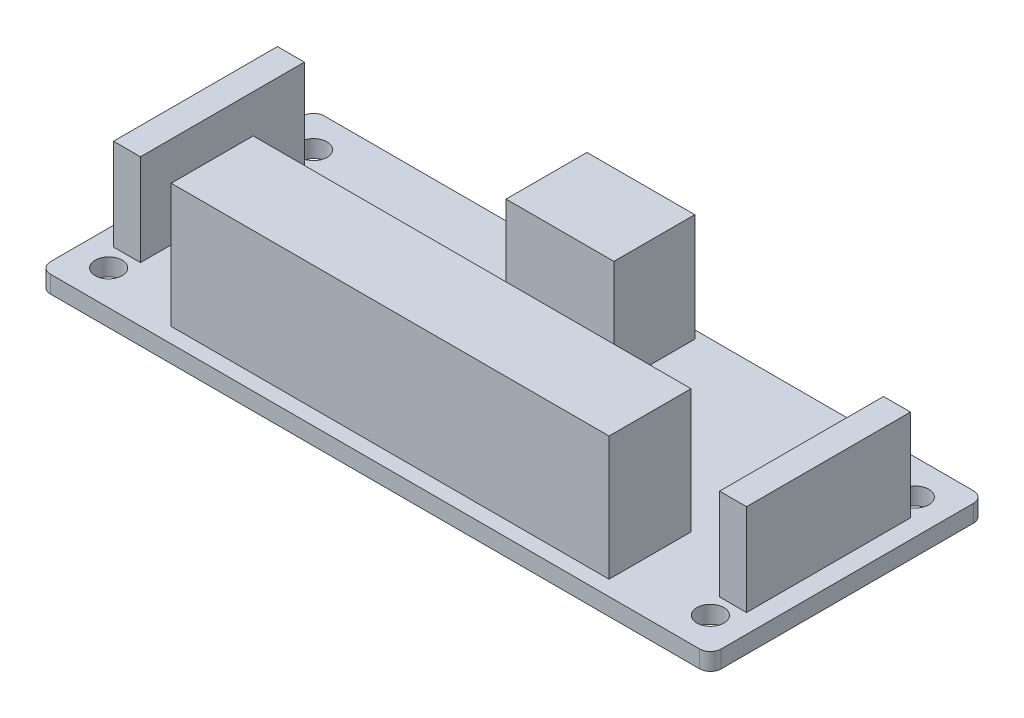
ISO-10303-21;
HEADER;
FILE_DESCRIPTION(('STEP AP214'),'2;1');
FILE_NAME('part.step','',(''),(''),'','','');
FILE_SCHEMA(('AUTOMOTIVE_DESIGN { 1 0 10303 214 1 1 1 1 }'));
ENDSEC;
DATA;
#1=APPLICATION_CONTEXT('core data for automotive mechanical design processes');
#2=APPLICATION_PROTOCOL_DEFINITION('international standard','automotive_design',2000,#1);
#3=PRODUCT_CONTEXT('',#1,'mechanical');
#4=PRODUCT('Part','Part','',(#3));
#5=PRODUCT_RELATED_PRODUCT_CATEGORY('part','',(#4));
#6=PRODUCT_DEFINITION_FORMATION('','',#4);
#7=PRODUCT_DEFINITION_CONTEXT('part definition',#1,'design');
#8=PRODUCT_DEFINITION('design','',#6,#7);
#9=PRODUCT_DEFINITION_SHAPE('','',#8);
#10=(LENGTH_UNIT() NAMED_UNIT(*) SI_UNIT(.MILLI.,.METRE.));
#11=(NAMED_UNIT(*) PLANE_ANGLE_UNIT() SI_UNIT($,.RADIAN.));
#12=(NAMED_UNIT(*) SI_UNIT($,.STERADIAN.) SOLID_ANGLE_UNIT());
#13=UNCERTAINTY_MEASURE_WITH_UNIT(LENGTH_MEASURE(1.E-05),#10,'distance_accuracy_value','');
#14=(GEOMETRIC_REPRESENTATION_CONTEXT(3) GLOBAL_UNCERTAINTY_ASSIGNED_CONTEXT((#13)) GLOBAL_UNIT_ASSIGNED_CONTEXT((#10,
#11,#12)) REPRESENTATION_CONTEXT('',''));
#15=CARTESIAN_POINT('',(0.,0.,0.));
#16=DIRECTION('',(0.,0.,1.));
#17=DIRECTION('',(1.,0.,0.));
#18=AXIS2_PLACEMENT_3D('',#15,#16,#17);
#19=CARTESIAN_POINT('',(-30.1,10.1,-49.7));
#20=DIRECTION('',(0.,-1.,0.));
#21=DIRECTION('',(0.,0.,-1.));
#22=AXIS2_PLACEMENT_3D('',#19,#20,#21);
#23=PLANE('',#22);
#24=DIRECTION('',(0.,0.,1.));
#25=VECTOR('',#24,1.);
#26=CARTESIAN_POINT('',(26.85,10.1,-30.4));
#27=LINE('',#26,#25);
#28=CARTESIAN_POINT('',(26.85,10.1,-45.6));
#29=VERTEX_POINT('',#28);
#30=CARTESIAN_POINT('',(26.85,10.1,-30.4));
#31=VERTEX_POINT('',#30);
#32=EDGE_CURVE('E251',#29,#31,#27,.T.);
#33=ORIENTED_EDGE('',*,*,#32,.F.);
#34=DIRECTION('',(-1.,0.,0.));
#35=VECTOR('',#34,1.);
#36=CARTESIAN_POINT('',(26.85,10.1,-45.6));
#37=LINE('',#36,#35);
#38=CARTESIAN_POINT('',(29.35,10.1,-45.6));
#39=VERTEX_POINT('',#38);
#40=EDGE_CURVE('E244',#39,#29,#37,.T.);
#41=ORIENTED_EDGE('',*,*,#40,.F.);
#42=DIRECTION('',(0.,0.,-1.));
#43=VECTOR('',#42,1.);
#44=CARTESIAN_POINT('',(29.35,10.1,-45.6));
#45=LINE('',#44,#43);
#46=CARTESIAN_POINT('',(29.35,10.1,-30.4));
#47=VERTEX_POINT('',#46);
#48=EDGE_CURVE('E246',#47,#39,#45,.T.);
#49=ORIENTED_EDGE('',*,*,#48,.F.);
#50=DIRECTION('',(1.,0.,0.));
#51=VECTOR('',#50,1.);
#52=CARTESIAN_POINT('',(29.35,10.1,-30.4));
#53=LINE('',#52,#51);
#54=EDGE_CURVE('E250',#31,#47,#53,.T.);
#55=ORIENTED_EDGE('',*,*,#54,.F.);
#56=EDGE_LOOP('',(#33,#41,#49,#55));
#57=FACE_BOUND('',#56,.T.);
#58=DIRECTION('',(0.,0.,1.));
#59=VECTOR('',#58,1.);
#60=CARTESIAN_POINT('',(-20.3,10.1,-26.7));
#61=LINE('',#60,#59);
#62=CARTESIAN_POINT('',(-20.3,10.1,-34.3));
#63=VERTEX_POINT('',#62);
#64=CARTESIAN_POINT('',(-20.3,10.1,-26.7));
#65=VERTEX_POINT('',#64);
#66=EDGE_CURVE('E295',#63,#65,#61,.T.);
#67=ORIENTED_EDGE('',*,*,#66,.F.);
#68=DIRECTION('',(-1.,0.,0.));
#69=VECTOR('',#68,1.);
#70=CARTESIAN_POINT('',(-20.3,10.1,-34.3));
#71=LINE('',#70,#69);
#72=CARTESIAN_POINT('',(20.3,10.1,-34.3));
#73=VERTEX_POINT('',#72);
#74=EDGE_CURVE('E300',#73,#63,#71,.T.);
#75=ORIENTED_EDGE('',*,*,#74,.F.);
#76=DIRECTION('',(0.,0.,-1.));
#77=VECTOR('',#76,1.);
#78=CARTESIAN_POINT('',(20.3,10.1,-34.3));
#79=LINE('',#78,#77);
#80=CARTESIAN_POINT('',(20.3,10.1,-26.7));
#81=VERTEX_POINT('',#80);
#82=EDGE_CURVE('E310',#81,#73,#79,.T.);
#83=ORIENTED_EDGE('',*,*,#82,.F.);
#84=DIRECTION('',(1.,0.,0.));
#85=VECTOR('',#84,1.);
#86=CARTESIAN_POINT('',(20.3,10.1,-26.7));
#87=LINE('',#86,#85);
#88=EDGE_CURVE('E308',#65,#81,#87,.T.);
#89=ORIENTED_EDGE('',*,*,#88,.F.);
#90=EDGE_LOOP('',(#67,#75,#83,#89));
#91=FACE_BOUND('',#90,.T.);
#92=CARTESIAN_POINT('',(-30.1,10.1,-49.7));
#93=DIRECTION('',(0.,1.,0.));
#94=DIRECTION('',(0.,0.,-1.));
#95=AXIS2_PLACEMENT_3D('',#92,#93,#94);
#96=CIRCLE('',#95,1.);
#97=CARTESIAN_POINT('',(-30.1,10.1,-50.7));
#98=VERTEX_POINT('',#97);
#99=CARTESIAN_POINT('',(-31.1,10.1,-49.7));
#100=VERTEX_POINT('',#99);
#101=EDGE_CURVE('E348',#98,#100,#96,.T.);
#102=ORIENTED_EDGE('',*,*,#101,.T.);
#103=DIRECTION('',(0.,0.,1.));
#104=VECTOR('',#103,1.);
#105=CARTESIAN_POINT('',(-31.1,10.1,-26.3));
#106=LINE('',#105,#104);
#107=CARTESIAN_POINT('',(-31.1,10.1,-26.3));
#108=VERTEX_POINT('',#107);
#109=EDGE_CURVE('E354',#100,#108,#106,.T.);
#110=ORIENTED_EDGE('',*,*,#109,.T.);
#111=CARTESIAN_POINT('',(-30.1,10.1,-26.3));
#112=DIRECTION('',(0.,1.,0.));
#113=DIRECTION('',(0.,0.,-1.));
#114=AXIS2_PLACEMENT_3D('',#111,#112,#113);
#115=CIRCLE('',#114,1.);
#116=CARTESIAN_POINT('',(-30.1,10.1,-25.3));
#117=VERTEX_POINT('',#116);
#118=EDGE_CURVE('E356',#108,#117,#115,.T.);
#119=ORIENTED_EDGE('',*,*,#118,.T.);
#120=DIRECTION('',(1.,0.,0.));
#121=VECTOR('',#120,1.);
#122=CARTESIAN_POINT('',(30.1,10.1,-25.3));
#123=LINE('',#122,#121);
#124=CARTESIAN_POINT('',(30.1,10.1,-25.3));
#125=VERTEX_POINT('',#124);
#126=EDGE_CURVE('E359',#117,#125,#123,.T.);
#127=ORIENTED_EDGE('',*,*,#126,.T.);
#128=CARTESIAN_POINT('',(30.1,10.1,-26.3));
#129=DIRECTION('',(0.,1.,0.));
#130=DIRECTION('',(0.,0.,-1.));
#131=AXIS2_PLACEMENT_3D('',#128,#129,#130);
#132=CIRCLE('',#131,1.);
#133=CARTESIAN_POINT('',(31.1,10.1,-26.3));
#134=VERTEX_POINT('',#133);
#135=EDGE_CURVE('E360',#125,#134,#132,.T.);
#136=ORIENTED_EDGE('',*,*,#135,.T.);
#137=DIRECTION('',(0.,0.,-1.));
#138=VECTOR('',#137,1.);
#139=CARTESIAN_POINT('',(31.1,10.1,-49.7));
#140=LINE('',#139,#138);
#141=CARTESIAN_POINT('',(31.1,10.1,-49.7));
#142=VERTEX_POINT('',#141);
#143=EDGE_CURVE('E362',#134,#142,#140,.T.);
#144=ORIENTED_EDGE('',*,*,#143,.T.);
#145=CARTESIAN_POINT('',(30.1,10.1,-49.7));
#146=DIRECTION('',(0.,1.,0.));
#147=DIRECTION('',(0.,0.,-1.));
#148=AXIS2_PLACEMENT_3D('',#145,#146,#147);
#149=CIRCLE('',#148,1.);
#150=CARTESIAN_POINT('',(30.1,10.1,-50.7));
#151=VERTEX_POINT('',#150);
#152=EDGE_CURVE('E365',#142,#151,#149,.T.);
#153=ORIENTED_EDGE('',*,*,#152,.T.);
#154=DIRECTION('',(-1.,0.,0.));
#155=VECTOR('',#154,1.);
#156=CARTESIAN_POINT('',(-30.1,10.1,-50.7));
#157=LINE('',#156,#155);
#158=EDGE_CURVE('E368',#151,#98,#157,.T.);
#159=ORIENTED_EDGE('',*,*,#158,.T.);
#160=EDGE_LOOP('',(#102,#110,#119,#127,#136,#144,#153,#159));
#161=FACE_BOUND('',#160,.T.);
#162=CARTESIAN_POINT('',(-27.9,10.1,-47.5));
#163=DIRECTION('',(0.,1.,0.));
#164=DIRECTION('',(0.,0.,1.));
#165=AXIS2_PLACEMENT_3D('',#162,#163,#164);
#166=CIRCLE('',#165,1.25);
#167=CARTESIAN_POINT('',(-27.9,10.1,-46.25));
#168=VERTEX_POINT('',#167);
#169=EDGE_CURVE('E343',#168,#168,#166,.T.);
#170=ORIENTED_EDGE('',*,*,#169,.F.);
#171=EDGE_LOOP('',(#170));
#172=FACE_BOUND('',#171,.T.);
#173=CARTESIAN_POINT('',(-27.9,10.1,-28.5));
#174=DIRECTION('',(0.,1.,0.));
#175=DIRECTION('',(0.,0.,1.));
#176=AXIS2_PLACEMENT_3D('',#173,#174,#175);
#177=CIRCLE('',#176,1.25);
#178=CARTESIAN_POINT('',(-27.9,10.1,-27.25));
#179=VERTEX_POINT('',#178);
#180=EDGE_CURVE('E339',#179,#179,#177,.T.);
#181=ORIENTED_EDGE('',*,*,#180,.F.);
#182=EDGE_LOOP('',(#181));
#183=FACE_BOUND('',#182,.T.);
#184=CARTESIAN_POINT('',(27.9,10.1,-47.5));
#185=DIRECTION('',(0.,1.,0.));
#186=DIRECTION('',(0.,0.,1.));
#187=AXIS2_PLACEMENT_3D('',#184,#185,#186);
#188=CIRCLE('',#187,1.25);
#189=CARTESIAN_POINT('',(27.9,10.1,-46.25));
#190=VERTEX_POINT('',#189);
#191=EDGE_CURVE('E335',#190,#190,#188,.T.);
#192=ORIENTED_EDGE('',*,*,#191,.F.);
#193=EDGE_LOOP('',(#192));
#194=FACE_BOUND('',#193,.T.);
#195=CARTESIAN_POINT('',(27.9,10.1,-28.5));
#196=DIRECTION('',(0.,1.,0.));
#197=DIRECTION('',(0.,0.,1.));
#198=AXIS2_PLACEMENT_3D('',#195,#196,#197);
#199=CIRCLE('',#198,1.25);
#200=CARTESIAN_POINT('',(27.9,10.1,-27.25));
#201=VERTEX_POINT('',#200);
#202=EDGE_CURVE('E326',#201,#201,#199,.T.);
#203=ORIENTED_EDGE('',*,*,#202,.F.);
#204=EDGE_LOOP('',(#203));
#205=FACE_BOUND('',#204,.T.);
#206=DIRECTION('',(0.,0.,1.));
#207=VECTOR('',#206,1.);
#208=CARTESIAN_POINT('',(-5.,10.1,-42.45));
#209=LINE('',#208,#207);
#210=CARTESIAN_POINT('',(-5.,10.1,-49.95));
#211=VERTEX_POINT('',#210);
#212=CARTESIAN_POINT('',(-5.,10.1,-42.45));
#213=VERTEX_POINT('',#212);
#214=EDGE_CURVE('E222',#211,#213,#209,.T.);
#215=ORIENTED_EDGE('',*,*,#214,.F.);
#216=DIRECTION('',(-1.,0.,0.));
#217=VECTOR('',#216,1.);
#218=CARTESIAN_POINT('',(-5.,10.1,-49.95));
#219=LINE('',#218,#217);
#220=CARTESIAN_POINT('',(5.,10.1,-49.95));
#221=VERTEX_POINT('',#220);
#222=EDGE_CURVE('E270',#221,#211,#219,.T.);
#223=ORIENTED_EDGE('',*,*,#222,.F.);
#224=DIRECTION('',(0.,0.,-1.));
#225=VECTOR('',#224,1.);
#226=CARTESIAN_POINT('',(5.,10.1,-49.95));
#227=LINE('',#226,#225);
#228=CARTESIAN_POINT('',(5.,10.1,-42.45));
#229=VERTEX_POINT('',#228);
#230=EDGE_CURVE('E277',#229,#221,#227,.T.);
#231=ORIENTED_EDGE('',*,*,#230,.F.);
#232=DIRECTION('',(1.,0.,0.));
#233=VECTOR('',#232,1.);
#234=CARTESIAN_POINT('',(5.,10.1,-42.45));
#235=LINE('',#234,#233);
#236=EDGE_CURVE('E221',#213,#229,#235,.T.);
#237=ORIENTED_EDGE('',*,*,#236,.F.);
#238=EDGE_LOOP('',(#215,#223,#231,#237));
#239=FACE_BOUND('',#238,.T.);
#240=DIRECTION('',(0.,0.,1.));
#241=VECTOR('',#240,1.);
#242=CARTESIAN_POINT('',(-29.35,10.1,-30.4));
#243=LINE('',#242,#241);
#244=CARTESIAN_POINT('',(-29.35,10.1,-45.6));
#245=VERTEX_POINT('',#244);
#246=CARTESIAN_POINT('',(-29.35,10.1,-30.4));
#247=VERTEX_POINT('',#246);
#248=EDGE_CURVE('E219',#245,#247,#243,.T.);
#249=ORIENTED_EDGE('',*,*,#248,.F.);
#250=DIRECTION('',(-1.,0.,0.));
#251=VECTOR('',#250,1.);
#252=CARTESIAN_POINT('',(-29.35,10.1,-45.6));
#253=LINE('',#252,#251);
#254=CARTESIAN_POINT('',(-26.85,10.1,-45.6));
#255=VERTEX_POINT('',#254);
#256=EDGE_CURVE('E220',#255,#245,#253,.T.);
#257=ORIENTED_EDGE('',*,*,#256,.F.);
#258=DIRECTION('',(0.,0.,-1.));
#259=VECTOR('',#258,1.);
#260=CARTESIAN_POINT('',(-26.85,10.1,-45.6));
#261=LINE('',#260,#259);
#262=CARTESIAN_POINT('',(-26.85,10.1,-30.4));
#263=VERTEX_POINT('',#262);
#264=EDGE_CURVE('E56',#263,#255,#261,.T.);
#265=ORIENTED_EDGE('',*,*,#264,.F.);
#266=DIRECTION('',(1.,0.,0.));
#267=VECTOR('',#266,1.);
#268=CARTESIAN_POINT('',(-26.85,10.1,-30.4));
#269=LINE('',#268,#267);
#270=EDGE_CURVE('E53',#247,#263,#269,.T.);
#271=ORIENTED_EDGE('',*,*,#270,.F.);
#272=EDGE_LOOP('',(#249,#257,#265,#271));
#273=FACE_BOUND('',#272,.T.);
#274=ADVANCED_FACE('F39',(#57,#91,#161,#172,#183,#194,#205,#239,#273),#23,.F.);
#275=CARTESIAN_POINT('',(-30.1,8.5,-49.7));
#276=DIRECTION('',(0.,-1.,0.));
#277=DIRECTION('',(0.,0.,-1.));
#278=AXIS2_PLACEMENT_3D('',#275,#276,#277);
#279=PLANE('',#278);
#280=CARTESIAN_POINT('',(27.9,8.5,-47.5));
#281=DIRECTION('',(0.,1.,0.));
#282=DIRECTION('',(0.,0.,1.));
#283=AXIS2_PLACEMENT_3D('',#280,#281,#282);
#284=CIRCLE('',#283,1.25);
#285=CARTESIAN_POINT('',(27.9,8.5,-46.25));
#286=VERTEX_POINT('',#285);
#287=EDGE_CURVE('E328',#286,#286,#284,.T.);
#288=ORIENTED_EDGE('',*,*,#287,.T.);
#289=EDGE_LOOP('',(#288));
#290=FACE_BOUND('',#289,.T.);
#291=CARTESIAN_POINT('',(-27.9,8.5,-47.5));
#292=DIRECTION('',(0.,1.,0.));
#293=DIRECTION('',(0.,0.,1.));
#294=AXIS2_PLACEMENT_3D('',#291,#292,#293);
#295=CIRCLE('',#294,1.25);
#296=CARTESIAN_POINT('',(-27.9,8.5,-46.25));
#297=VERTEX_POINT('',#296);
#298=EDGE_CURVE('E341',#297,#297,#295,.T.);
#299=ORIENTED_EDGE('',*,*,#298,.T.);
#300=EDGE_LOOP('',(#299));
#301=FACE_BOUND('',#300,.T.);
#302=CARTESIAN_POINT('',(-30.1,8.5,-49.7));
#303=DIRECTION('',(0.,1.,0.));
#304=DIRECTION('',(0.,0.,-1.));
#305=AXIS2_PLACEMENT_3D('',#302,#303,#304);
#306=CIRCLE('',#305,1.);
#307=CARTESIAN_POINT('',(-30.1,8.5,-50.7));
#308=VERTEX_POINT('',#307);
#309=CARTESIAN_POINT('',(-31.1,8.5,-49.7));
#310=VERTEX_POINT('',#309);
#311=EDGE_CURVE('E350',#308,#310,#306,.T.);
#312=ORIENTED_EDGE('',*,*,#311,.F.);
#313=DIRECTION('',(-1.,0.,0.));
#314=VECTOR('',#313,1.);
#315=CARTESIAN_POINT('',(-30.1,8.5,-50.7));
#316=LINE('',#315,#314);
#317=CARTESIAN_POINT('',(30.1,8.5,-50.7));
#318=VERTEX_POINT('',#317);
#319=EDGE_CURVE('E351',#318,#308,#316,.T.);
#320=ORIENTED_EDGE('',*,*,#319,.F.);
#321=CARTESIAN_POINT('',(30.1,8.5,-49.7));
#322=DIRECTION('',(0.,1.,0.));
#323=DIRECTION('',(0.,0.,-1.));
#324=AXIS2_PLACEMENT_3D('',#321,#322,#323);
#325=CIRCLE('',#324,1.);
#326=CARTESIAN_POINT('',(31.1,8.5,-49.7));
#327=VERTEX_POINT('',#326);
#328=EDGE_CURVE('E381',#327,#318,#325,.T.);
#329=ORIENTED_EDGE('',*,*,#328,.F.);
#330=DIRECTION('',(0.,0.,-1.));
#331=VECTOR('',#330,1.);
#332=CARTESIAN_POINT('',(31.1,8.5,-49.7));
#333=LINE('',#332,#331);
#334=CARTESIAN_POINT('',(31.1,8.5,-26.3));
#335=VERTEX_POINT('',#334);
#336=EDGE_CURVE('E377',#335,#327,#333,.T.);
#337=ORIENTED_EDGE('',*,*,#336,.F.);
#338=CARTESIAN_POINT('',(30.1,8.5,-26.3));
#339=DIRECTION('',(0.,1.,0.));
#340=DIRECTION('',(0.,0.,-1.));
#341=AXIS2_PLACEMENT_3D('',#338,#339,#340);
#342=CIRCLE('',#341,1.);
#343=CARTESIAN_POINT('',(30.1,8.5,-25.3));
#344=VERTEX_POINT('',#343);
#345=EDGE_CURVE('E380',#344,#335,#342,.T.);
#346=ORIENTED_EDGE('',*,*,#345,.F.);
#347=DIRECTION('',(1.,0.,0.));
#348=VECTOR('',#347,1.);
#349=CARTESIAN_POINT('',(30.1,8.5,-25.3));
#350=LINE('',#349,#348);
#351=CARTESIAN_POINT('',(-30.1,8.5,-25.3));
#352=VERTEX_POINT('',#351);
#353=EDGE_CURVE('E374',#352,#344,#350,.T.);
#354=ORIENTED_EDGE('',*,*,#353,.F.);
#355=CARTESIAN_POINT('',(-30.1,8.5,-26.3));
#356=DIRECTION('',(0.,1.,0.));
#357=DIRECTION('',(0.,0.,-1.));
#358=AXIS2_PLACEMENT_3D('',#355,#356,#357);
#359=CIRCLE('',#358,1.);
#360=CARTESIAN_POINT('',(-31.1,8.5,-26.3));
#361=VERTEX_POINT('',#360);
#362=EDGE_CURVE('E373',#361,#352,#359,.T.);
#363=ORIENTED_EDGE('',*,*,#362,.F.);
#364=DIRECTION('',(0.,0.,1.));
#365=VECTOR('',#364,1.);
#366=CARTESIAN_POINT('',(-31.1,8.5,-26.3));
#367=LINE('',#366,#365);
#368=EDGE_CURVE('E371',#310,#361,#367,.T.);
#369=ORIENTED_EDGE('',*,*,#368,.F.);
#370=EDGE_LOOP('',(#312,#320,#329,#337,#346,#354,#363,#369));
#371=FACE_BOUND('',#370,.T.);
#372=CARTESIAN_POINT('',(-27.9,8.5,-28.5));
#373=DIRECTION('',(0.,1.,0.));
#374=DIRECTION('',(0.,0.,1.));
#375=AXIS2_PLACEMENT_3D('',#372,#373,#374);
#376=CIRCLE('',#375,1.25);
#377=CARTESIAN_POINT('',(-27.9,8.5,-27.25));
#378=VERTEX_POINT('',#377);
#379=EDGE_CURVE('E333',#378,#378,#376,.T.);
#380=ORIENTED_EDGE('',*,*,#379,.T.);
#381=EDGE_LOOP('',(#380));
#382=FACE_BOUND('',#381,.T.);
#383=CARTESIAN_POINT('',(27.9,8.5,-28.5));
#384=DIRECTION('',(0.,1.,0.));
#385=DIRECTION('',(0.,0.,1.));
#386=AXIS2_PLACEMENT_3D('',#383,#384,#385);
#387=CIRCLE('',#386,1.25);
#388=CARTESIAN_POINT('',(27.9,8.5,-27.25));
#389=VERTEX_POINT('',#388);
#390=EDGE_CURVE('E324',#389,#389,#387,.T.);
#391=ORIENTED_EDGE('',*,*,#390,.T.);
#392=EDGE_LOOP('',(#391));
#393=FACE_BOUND('',#392,.T.);
#394=ADVANCED_FACE('F411',(#290,#301,#371,#382,#393),#279,.T.);
#395=CARTESIAN_POINT('',(-30.1,10.1,-49.7));
#396=DIRECTION('',(0.,-1.,0.));
#397=DIRECTION('',(0.,0.,-1.));
#398=AXIS2_PLACEMENT_3D('',#395,#396,#397);
#399=CYLINDRICAL_SURFACE('',#398,1.);
#400=ORIENTED_EDGE('',*,*,#311,.T.);
#401=DIRECTION('',(0.,-1.,0.));
#402=VECTOR('',#401,1.);
#403=CARTESIAN_POINT('',(-31.1,10.1,-49.7));
#404=LINE('',#403,#402);
#405=EDGE_CURVE('E11',#100,#310,#404,.T.);
#406=ORIENTED_EDGE('',*,*,#405,.F.);
#407=ORIENTED_EDGE('',*,*,#101,.F.);
#408=DIRECTION('',(0.,-1.,0.));
#409=VECTOR('',#408,1.);
#410=CARTESIAN_POINT('',(-30.1,10.1,-50.7));
#411=LINE('',#410,#409);
#412=EDGE_CURVE('E366',#98,#308,#411,.T.);
#413=ORIENTED_EDGE('',*,*,#412,.T.);
#414=EDGE_LOOP('',(#400,#406,#407,#413));
#415=FACE_BOUND('',#414,.T.);
#416=ADVANCED_FACE('F41',(#415),#399,.T.);
#417=CARTESIAN_POINT('',(-31.1,10.1,-26.3));
#418=DIRECTION('',(1.,0.,0.));
#419=DIRECTION('',(0.,0.,-1.));
#420=AXIS2_PLACEMENT_3D('',#417,#418,#419);
#421=PLANE('',#420);
#422=ORIENTED_EDGE('',*,*,#368,.T.);
#423=DIRECTION('',(0.,-1.,0.));
#424=VECTOR('',#423,1.);
#425=CARTESIAN_POINT('',(-31.1,10.1,-26.3));
#426=LINE('',#425,#424);
#427=EDGE_CURVE('E50',#108,#361,#426,.T.);
#428=ORIENTED_EDGE('',*,*,#427,.F.);
#429=ORIENTED_EDGE('',*,*,#109,.F.);
#430=ORIENTED_EDGE('',*,*,#405,.T.);
#431=EDGE_LOOP('',(#422,#428,#429,#430));
#432=FACE_BOUND('',#431,.T.);
#433=ADVANCED_FACE('F427',(#432),#421,.F.);
#434=CARTESIAN_POINT('',(-30.1,10.1,-26.3));
#435=DIRECTION('',(0.,-1.,0.));
#436=DIRECTION('',(0.,0.,-1.));
#437=AXIS2_PLACEMENT_3D('',#434,#435,#436);
#438=CYLINDRICAL_SURFACE('',#437,1.);
#439=ORIENTED_EDGE('',*,*,#362,.T.);
#440=DIRECTION('',(0.,-1.,0.));
#441=VECTOR('',#440,1.);
#442=CARTESIAN_POINT('',(-30.1,10.1,-25.3));
#443=LINE('',#442,#441);
#444=EDGE_CURVE('E399',#117,#352,#443,.T.);
#445=ORIENTED_EDGE('',*,*,#444,.F.);
#446=ORIENTED_EDGE('',*,*,#118,.F.);
#447=ORIENTED_EDGE('',*,*,#427,.T.);
#448=EDGE_LOOP('',(#439,#445,#446,#447));
#449=FACE_BOUND('',#448,.T.);
#450=ADVANCED_FACE('F403',(#449),#438,.T.);
#451=CARTESIAN_POINT('',(30.1,10.1,-25.3));
#452=DIRECTION('',(0.,0.,-1.));
#453=DIRECTION('',(-1.,0.,0.));
#454=AXIS2_PLACEMENT_3D('',#451,#452,#453);
#455=PLANE('',#454);
#456=ORIENTED_EDGE('',*,*,#353,.T.);
#457=DIRECTION('',(0.,-1.,0.));
#458=VECTOR('',#457,1.);
#459=CARTESIAN_POINT('',(30.1,10.1,-25.3));
#460=LINE('',#459,#458);
#461=EDGE_CURVE('E393',#125,#344,#460,.T.);
#462=ORIENTED_EDGE('',*,*,#461,.F.);
#463=ORIENTED_EDGE('',*,*,#126,.F.);
#464=ORIENTED_EDGE('',*,*,#444,.T.);
#465=EDGE_LOOP('',(#456,#462,#463,#464));
#466=FACE_BOUND('',#465,.T.);
#467=ADVANCED_FACE('F417',(#466),#455,.F.);
#468=CARTESIAN_POINT('',(30.1,10.1,-26.3));
#469=DIRECTION('',(0.,-1.,0.));
#470=DIRECTION('',(0.,0.,-1.));
#471=AXIS2_PLACEMENT_3D('',#468,#469,#470);
#472=CYLINDRICAL_SURFACE('',#471,1.);
#473=ORIENTED_EDGE('',*,*,#345,.T.);
#474=DIRECTION('',(0.,-1.,0.));
#475=VECTOR('',#474,1.);
#476=CARTESIAN_POINT('',(31.1,10.1,-26.3));
#477=LINE('',#476,#475);
#478=EDGE_CURVE('E395',#134,#335,#477,.T.);
#479=ORIENTED_EDGE('',*,*,#478,.F.);
#480=ORIENTED_EDGE('',*,*,#135,.F.);
#481=ORIENTED_EDGE('',*,*,#461,.T.);
#482=EDGE_LOOP('',(#473,#479,#480,#481));
#483=FACE_BOUND('',#482,.T.);
#484=ADVANCED_FACE('F423',(#483),#472,.T.);
#485=CARTESIAN_POINT('',(31.1,10.1,-49.7));
#486=DIRECTION('',(-1.,0.,0.));
#487=DIRECTION('',(0.,0.,1.));
#488=AXIS2_PLACEMENT_3D('',#485,#486,#487);
#489=PLANE('',#488);
#490=ORIENTED_EDGE('',*,*,#336,.T.);
#491=DIRECTION('',(0.,-1.,0.));
#492=VECTOR('',#491,1.);
#493=CARTESIAN_POINT('',(31.1,10.1,-49.7));
#494=LINE('',#493,#492);
#495=EDGE_CURVE('E386',#142,#327,#494,.T.);
#496=ORIENTED_EDGE('',*,*,#495,.F.);
#497=ORIENTED_EDGE('',*,*,#143,.F.);
#498=ORIENTED_EDGE('',*,*,#478,.T.);
#499=EDGE_LOOP('',(#490,#496,#497,#498));
#500=FACE_BOUND('',#499,.T.);
#501=ADVANCED_FACE('F445',(#500),#489,.F.);
#502=CARTESIAN_POINT('',(30.1,10.1,-49.7));
#503=DIRECTION('',(0.,-1.,0.));
#504=DIRECTION('',(0.,0.,-1.));
#505=AXIS2_PLACEMENT_3D('',#502,#503,#504);
#506=CYLINDRICAL_SURFACE('',#505,1.);
#507=ORIENTED_EDGE('',*,*,#328,.T.);
#508=DIRECTION('',(0.,-1.,0.));
#509=VECTOR('',#508,1.);
#510=CARTESIAN_POINT('',(30.1,10.1,-50.7));
#511=LINE('',#510,#509);
#512=EDGE_CURVE('E387',#151,#318,#511,.T.);
#513=ORIENTED_EDGE('',*,*,#512,.F.);
#514=ORIENTED_EDGE('',*,*,#152,.F.);
#515=ORIENTED_EDGE('',*,*,#495,.T.);
#516=EDGE_LOOP('',(#507,#513,#514,#515));
#517=FACE_BOUND('',#516,.T.);
#518=ADVANCED_FACE('F439',(#517),#506,.T.);
#519=CARTESIAN_POINT('',(-30.1,10.1,-50.7));
#520=DIRECTION('',(0.,0.,1.));
#521=DIRECTION('',(1.,0.,0.));
#522=AXIS2_PLACEMENT_3D('',#519,#520,#521);
#523=PLANE('',#522);
#524=ORIENTED_EDGE('',*,*,#319,.T.);
#525=ORIENTED_EDGE('',*,*,#412,.F.);
#526=ORIENTED_EDGE('',*,*,#158,.F.);
#527=ORIENTED_EDGE('',*,*,#512,.T.);
#528=EDGE_LOOP('',(#524,#525,#526,#527));
#529=FACE_BOUND('',#528,.T.);
#530=ADVANCED_FACE('F434',(#529),#523,.F.);
#531=CARTESIAN_POINT('',(-27.9,10.1,-47.5));
#532=DIRECTION('',(0.,-1.,0.));
#533=DIRECTION('',(0.,0.,-1.));
#534=AXIS2_PLACEMENT_3D('',#531,#532,#533);
#535=CYLINDRICAL_SURFACE('',#534,1.25);
#536=ORIENTED_EDGE('',*,*,#169,.T.);
#537=EDGE_LOOP('',(#536));
#538=FACE_BOUND('',#537,.T.);
#539=ORIENTED_EDGE('',*,*,#298,.F.);
#540=EDGE_LOOP('',(#539));
#541=FACE_BOUND('',#540,.T.);
#542=ADVANCED_FACE('F464',(#538,#541),#535,.F.);
#543=CARTESIAN_POINT('',(-27.9,10.1,-28.5));
#544=DIRECTION('',(0.,-1.,0.));
#545=DIRECTION('',(0.,0.,-1.));
#546=AXIS2_PLACEMENT_3D('',#543,#544,#545);
#547=CYLINDRICAL_SURFACE('',#546,1.25);
#548=ORIENTED_EDGE('',*,*,#180,.T.);
#549=EDGE_LOOP('',(#548));
#550=FACE_BOUND('',#549,.T.);
#551=ORIENTED_EDGE('',*,*,#379,.F.);
#552=EDGE_LOOP('',(#551));
#553=FACE_BOUND('',#552,.T.);
#554=ADVANCED_FACE('F470',(#550,#553),#547,.F.);
#555=CARTESIAN_POINT('',(27.9,10.1,-47.5));
#556=DIRECTION('',(0.,-1.,0.));
#557=DIRECTION('',(0.,0.,-1.));
#558=AXIS2_PLACEMENT_3D('',#555,#556,#557);
#559=CYLINDRICAL_SURFACE('',#558,1.25);
#560=ORIENTED_EDGE('',*,*,#191,.T.);
#561=EDGE_LOOP('',(#560));
#562=FACE_BOUND('',#561,.T.);
#563=ORIENTED_EDGE('',*,*,#287,.F.);
#564=EDGE_LOOP('',(#563));
#565=FACE_BOUND('',#564,.T.);
#566=ADVANCED_FACE('F474',(#562,#565),#559,.F.);
#567=CARTESIAN_POINT('',(27.9,10.1,-28.5));
#568=DIRECTION('',(0.,-1.,0.));
#569=DIRECTION('',(0.,0.,-1.));
#570=AXIS2_PLACEMENT_3D('',#567,#568,#569);
#571=CYLINDRICAL_SURFACE('',#570,1.25);
#572=ORIENTED_EDGE('',*,*,#202,.T.);
#573=EDGE_LOOP('',(#572));
#574=FACE_BOUND('',#573,.T.);
#575=ORIENTED_EDGE('',*,*,#390,.F.);
#576=EDGE_LOOP('',(#575));
#577=FACE_BOUND('',#576,.T.);
#578=ADVANCED_FACE('F575',(#574,#577),#571,.F.);
#579=CARTESIAN_POINT('',(-20.3,21.6,-26.7));
#580=DIRECTION('',(1.,0.,0.));
#581=DIRECTION('',(0.,0.,-1.));
#582=AXIS2_PLACEMENT_3D('',#579,#580,#581);
#583=PLANE('',#582);
#584=ORIENTED_EDGE('',*,*,#66,.T.);
#585=DIRECTION('',(0.,-1.,0.));
#586=VECTOR('',#585,1.);
#587=CARTESIAN_POINT('',(-20.3,21.6,-26.7));
#588=LINE('',#587,#586);
#589=CARTESIAN_POINT('',(-20.3,21.6,-26.7));
#590=VERTEX_POINT('',#589);
#591=EDGE_CURVE('E325',#590,#65,#588,.T.);
#592=ORIENTED_EDGE('',*,*,#591,.F.);
#593=DIRECTION('',(0.,0.,1.));
#594=VECTOR('',#593,1.);
#595=CARTESIAN_POINT('',(-20.3,21.6,-26.7));
#596=LINE('',#595,#594);
#597=CARTESIAN_POINT('',(-20.3,21.6,-34.3));
#598=VERTEX_POINT('',#597);
#599=EDGE_CURVE('E291',#598,#590,#596,.T.);
#600=ORIENTED_EDGE('',*,*,#599,.F.);
#601=DIRECTION('',(0.,-1.,0.));
#602=VECTOR('',#601,1.);
#603=CARTESIAN_POINT('',(-20.3,21.6,-34.3));
#604=LINE('',#603,#602);
#605=EDGE_CURVE('E304',#598,#63,#604,.T.);
#606=ORIENTED_EDGE('',*,*,#605,.T.);
#607=EDGE_LOOP('',(#584,#592,#600,#606));
#608=FACE_BOUND('',#607,.T.);
#609=ADVANCED_FACE('F566',(#608),#583,.F.);
#610=CARTESIAN_POINT('',(20.3,21.6,-26.7));
#611=DIRECTION('',(0.,0.,-1.));
#612=DIRECTION('',(-1.,0.,0.));
#613=AXIS2_PLACEMENT_3D('',#610,#611,#612);
#614=PLANE('',#613);
#615=ORIENTED_EDGE('',*,*,#88,.T.);
#616=DIRECTION('',(0.,-1.,0.));
#617=VECTOR('',#616,1.);
#618=CARTESIAN_POINT('',(20.3,21.6,-26.7));
#619=LINE('',#618,#617);
#620=CARTESIAN_POINT('',(20.3,21.6,-26.7));
#621=VERTEX_POINT('',#620);
#622=EDGE_CURVE('E317',#621,#81,#619,.T.);
#623=ORIENTED_EDGE('',*,*,#622,.F.);
#624=DIRECTION('',(1.,0.,0.));
#625=VECTOR('',#624,1.);
#626=CARTESIAN_POINT('',(20.3,21.6,-26.7));
#627=LINE('',#626,#625);
#628=EDGE_CURVE('E297',#590,#621,#627,.T.);
#629=ORIENTED_EDGE('',*,*,#628,.F.);
#630=ORIENTED_EDGE('',*,*,#591,.T.);
#631=EDGE_LOOP('',(#615,#623,#629,#630));
#632=FACE_BOUND('',#631,.T.);
#633=ADVANCED_FACE('F563',(#632),#614,.F.);
#634=CARTESIAN_POINT('',(20.3,21.6,-34.3));
#635=DIRECTION('',(-1.,0.,0.));
#636=DIRECTION('',(0.,0.,1.));
#637=AXIS2_PLACEMENT_3D('',#634,#635,#636);
#638=PLANE('',#637);
#639=ORIENTED_EDGE('',*,*,#82,.T.);
#640=DIRECTION('',(0.,-1.,0.));
#641=VECTOR('',#640,1.);
#642=CARTESIAN_POINT('',(20.3,21.6,-34.3));
#643=LINE('',#642,#641);
#644=CARTESIAN_POINT('',(20.3,21.6,-34.3));
#645=VERTEX_POINT('',#644);
#646=EDGE_CURVE('E316',#645,#73,#643,.T.);
#647=ORIENTED_EDGE('',*,*,#646,.F.);
#648=DIRECTION('',(0.,0.,-1.));
#649=VECTOR('',#648,1.);
#650=CARTESIAN_POINT('',(20.3,21.6,-34.3));
#651=LINE('',#650,#649);
#652=EDGE_CURVE('E296',#621,#645,#651,.T.);
#653=ORIENTED_EDGE('',*,*,#652,.F.);
#654=ORIENTED_EDGE('',*,*,#622,.T.);
#655=EDGE_LOOP('',(#639,#647,#653,#654));
#656=FACE_BOUND('',#655,.T.);
#657=ADVANCED_FACE('F558',(#656),#638,.F.);
#658=CARTESIAN_POINT('',(-20.3,21.6,-34.3));
#659=DIRECTION('',(0.,0.,1.));
#660=DIRECTION('',(1.,0.,0.));
#661=AXIS2_PLACEMENT_3D('',#658,#659,#660);
#662=PLANE('',#661);
#663=ORIENTED_EDGE('',*,*,#74,.T.);
#664=ORIENTED_EDGE('',*,*,#605,.F.);
#665=DIRECTION('',(-1.,0.,0.));
#666=VECTOR('',#665,1.);
#667=CARTESIAN_POINT('',(-20.3,21.6,-34.3));
#668=LINE('',#667,#666);
#669=EDGE_CURVE('E301',#645,#598,#668,.T.);
#670=ORIENTED_EDGE('',*,*,#669,.F.);
#671=ORIENTED_EDGE('',*,*,#646,.T.);
#672=EDGE_LOOP('',(#663,#664,#670,#671));
#673=FACE_BOUND('',#672,.T.);
#674=ADVANCED_FACE('F557',(#673),#662,.F.);
#675=CARTESIAN_POINT('',(0.,21.6,0.));
#676=DIRECTION('',(0.,-1.,0.));
#677=DIRECTION('',(0.,0.,-1.));
#678=AXIS2_PLACEMENT_3D('',#675,#676,#677);
#679=PLANE('',#678);
#680=ORIENTED_EDGE('',*,*,#599,.T.);
#681=ORIENTED_EDGE('',*,*,#628,.T.);
#682=ORIENTED_EDGE('',*,*,#652,.T.);
#683=ORIENTED_EDGE('',*,*,#669,.T.);
#684=EDGE_LOOP('',(#680,#681,#682,#683));
#685=FACE_BOUND('',#684,.T.);
#686=ADVANCED_FACE('F555',(#685),#679,.F.);
#687=CARTESIAN_POINT('',(-5.,20.1,-42.45));
#688=DIRECTION('',(1.,0.,0.));
#689=DIRECTION('',(0.,0.,-1.));
#690=AXIS2_PLACEMENT_3D('',#687,#688,#689);
#691=PLANE('',#690);
#692=ORIENTED_EDGE('',*,*,#214,.T.);
#693=DIRECTION('',(0.,-1.,0.));
#694=VECTOR('',#693,1.);
#695=CARTESIAN_POINT('',(-5.,20.1,-42.45));
#696=LINE('',#695,#694);
#697=CARTESIAN_POINT('',(-5.,20.1,-42.45));
#698=VERTEX_POINT('',#697);
#699=EDGE_CURVE('E288',#698,#213,#696,.T.);
#700=ORIENTED_EDGE('',*,*,#699,.F.);
#701=DIRECTION('',(0.,0.,1.));
#702=VECTOR('',#701,1.);
#703=CARTESIAN_POINT('',(-5.,20.1,-42.45));
#704=LINE('',#703,#702);
#705=CARTESIAN_POINT('',(-5.,20.1,-49.95));
#706=VERTEX_POINT('',#705);
#707=EDGE_CURVE('E263',#706,#698,#704,.T.);
#708=ORIENTED_EDGE('',*,*,#707,.F.);
#709=DIRECTION('',(0.,-1.,0.));
#710=VECTOR('',#709,1.);
#711=CARTESIAN_POINT('',(-5.,20.1,-49.95));
#712=LINE('',#711,#710);
#713=EDGE_CURVE('E275',#706,#211,#712,.T.);
#714=ORIENTED_EDGE('',*,*,#713,.T.);
#715=EDGE_LOOP('',(#692,#700,#708,#714));
#716=FACE_BOUND('',#715,.T.);
#717=ADVANCED_FACE('F547',(#716),#691,.F.);
#718=CARTESIAN_POINT('',(5.,20.1,-42.45));
#719=DIRECTION('',(0.,0.,-1.));
#720=DIRECTION('',(-1.,0.,0.));
#721=AXIS2_PLACEMENT_3D('',#718,#719,#720);
#722=PLANE('',#721);
#723=ORIENTED_EDGE('',*,*,#236,.T.);
#724=DIRECTION('',(0.,-1.,0.));
#725=VECTOR('',#724,1.);
#726=CARTESIAN_POINT('',(5.,20.1,-42.45));
#727=LINE('',#726,#725);
#728=CARTESIAN_POINT('',(5.,20.1,-42.45));
#729=VERTEX_POINT('',#728);
#730=EDGE_CURVE('E286',#729,#229,#727,.T.);
#731=ORIENTED_EDGE('',*,*,#730,.F.);
#732=DIRECTION('',(1.,0.,0.));
#733=VECTOR('',#732,1.);
#734=CARTESIAN_POINT('',(5.,20.1,-42.45));
#735=LINE('',#734,#733);
#736=EDGE_CURVE('E266',#698,#729,#735,.T.);
#737=ORIENTED_EDGE('',*,*,#736,.F.);
#738=ORIENTED_EDGE('',*,*,#699,.T.);
#739=EDGE_LOOP('',(#723,#731,#737,#738));
#740=FACE_BOUND('',#739,.T.);
#741=ADVANCED_FACE('F542',(#740),#722,.F.);
#742=CARTESIAN_POINT('',(5.,20.1,-49.95));
#743=DIRECTION('',(-1.,0.,0.));
#744=DIRECTION('',(0.,0.,1.));
#745=AXIS2_PLACEMENT_3D('',#742,#743,#744);
#746=PLANE('',#745);
#747=ORIENTED_EDGE('',*,*,#230,.T.);
#748=DIRECTION('',(0.,-1.,0.));
#749=VECTOR('',#748,1.);
#750=CARTESIAN_POINT('',(5.,20.1,-49.95));
#751=LINE('',#750,#749);
#752=CARTESIAN_POINT('',(5.,20.1,-49.95));
#753=VERTEX_POINT('',#752);
#754=EDGE_CURVE('E284',#753,#221,#751,.T.);
#755=ORIENTED_EDGE('',*,*,#754,.F.);
#756=DIRECTION('',(0.,0.,-1.));
#757=VECTOR('',#756,1.);
#758=CARTESIAN_POINT('',(5.,20.1,-49.95));
#759=LINE('',#758,#757);
#760=EDGE_CURVE('E267',#729,#753,#759,.T.);
#761=ORIENTED_EDGE('',*,*,#760,.F.);
#762=ORIENTED_EDGE('',*,*,#730,.T.);
#763=EDGE_LOOP('',(#747,#755,#761,#762));
#764=FACE_BOUND('',#763,.T.);
#765=ADVANCED_FACE('F539',(#764),#746,.F.);
#766=CARTESIAN_POINT('',(-5.,20.1,-49.95));
#767=DIRECTION('',(0.,0.,1.));
#768=DIRECTION('',(1.,0.,0.));
#769=AXIS2_PLACEMENT_3D('',#766,#767,#768);
#770=PLANE('',#769);
#771=ORIENTED_EDGE('',*,*,#222,.T.);
#772=ORIENTED_EDGE('',*,*,#713,.F.);
#773=DIRECTION('',(-1.,0.,0.));
#774=VECTOR('',#773,1.);
#775=CARTESIAN_POINT('',(-5.,20.1,-49.95));
#776=LINE('',#775,#774);
#777=EDGE_CURVE('E271',#753,#706,#776,.T.);
#778=ORIENTED_EDGE('',*,*,#777,.F.);
#779=ORIENTED_EDGE('',*,*,#754,.T.);
#780=EDGE_LOOP('',(#771,#772,#778,#779));
#781=FACE_BOUND('',#780,.T.);
#782=ADVANCED_FACE('F536',(#781),#770,.F.);
#783=CARTESIAN_POINT('',(0.,20.1,0.));
#784=DIRECTION('',(0.,-1.,0.));
#785=DIRECTION('',(0.,0.,-1.));
#786=AXIS2_PLACEMENT_3D('',#783,#784,#785);
#787=PLANE('',#786);
#788=ORIENTED_EDGE('',*,*,#707,.T.);
#789=ORIENTED_EDGE('',*,*,#736,.T.);
#790=ORIENTED_EDGE('',*,*,#760,.T.);
#791=ORIENTED_EDGE('',*,*,#777,.T.);
#792=EDGE_LOOP('',(#788,#789,#790,#791));
#793=FACE_BOUND('',#792,.T.);
#794=ADVANCED_FACE('F516',(#793),#787,.F.);
#795=CARTESIAN_POINT('',(26.85,18.6,-30.4));
#796=DIRECTION('',(1.,0.,0.));
#797=DIRECTION('',(0.,0.,-1.));
#798=AXIS2_PLACEMENT_3D('',#795,#796,#797);
#799=PLANE('',#798);
#800=ORIENTED_EDGE('',*,*,#32,.T.);
#801=DIRECTION('',(0.,-1.,0.));
#802=VECTOR('',#801,1.);
#803=CARTESIAN_POINT('',(26.85,18.6,-30.4));
#804=LINE('',#803,#802);
#805=CARTESIAN_POINT('',(26.85,18.6,-30.4));
#806=VERTEX_POINT('',#805);
#807=EDGE_CURVE('E228',#806,#31,#804,.T.);
#808=ORIENTED_EDGE('',*,*,#807,.F.);
#809=DIRECTION('',(0.,0.,1.));
#810=VECTOR('',#809,1.);
#811=CARTESIAN_POINT('',(26.85,18.6,-30.4));
#812=LINE('',#811,#810);
#813=CARTESIAN_POINT('',(26.85,18.6,-45.6));
#814=VERTEX_POINT('',#813);
#815=EDGE_CURVE('E247',#814,#806,#812,.T.);
#816=ORIENTED_EDGE('',*,*,#815,.F.);
#817=DIRECTION('',(0.,-1.,0.));
#818=VECTOR('',#817,1.);
#819=CARTESIAN_POINT('',(26.85,18.6,-45.6));
#820=LINE('',#819,#818);
#821=EDGE_CURVE('E239',#814,#29,#820,.T.);
#822=ORIENTED_EDGE('',*,*,#821,.T.);
#823=EDGE_LOOP('',(#800,#808,#816,#822));
#824=FACE_BOUND('',#823,.T.);
#825=ADVANCED_FACE('F517',(#824),#799,.F.);
#826=CARTESIAN_POINT('',(29.35,18.6,-30.4));
#827=DIRECTION('',(0.,0.,-1.));
#828=DIRECTION('',(-1.,0.,0.));
#829=AXIS2_PLACEMENT_3D('',#826,#827,#828);
#830=PLANE('',#829);
#831=ORIENTED_EDGE('',*,*,#54,.T.);
#832=DIRECTION('',(0.,-1.,0.));
#833=VECTOR('',#832,1.);
#834=CARTESIAN_POINT('',(29.35,18.6,-30.4));
#835=LINE('',#834,#833);
#836=CARTESIAN_POINT('',(29.35,18.6,-30.4));
#837=VERTEX_POINT('',#836);
#838=EDGE_CURVE('E234',#837,#47,#835,.T.);
#839=ORIENTED_EDGE('',*,*,#838,.F.);
#840=DIRECTION('',(1.,0.,0.));
#841=VECTOR('',#840,1.);
#842=CARTESIAN_POINT('',(29.35,18.6,-30.4));
#843=LINE('',#842,#841);
#844=EDGE_CURVE('E259',#806,#837,#843,.T.);
#845=ORIENTED_EDGE('',*,*,#844,.F.);
#846=ORIENTED_EDGE('',*,*,#807,.T.);
#847=EDGE_LOOP('',(#831,#839,#845,#846));
#848=FACE_BOUND('',#847,.T.);
#849=ADVANCED_FACE('F519',(#848),#830,.F.);
#850=CARTESIAN_POINT('',(29.35,18.6,-45.6));
#851=DIRECTION('',(-1.,0.,0.));
#852=DIRECTION('',(0.,0.,1.));
#853=AXIS2_PLACEMENT_3D('',#850,#851,#852);
#854=PLANE('',#853);
#855=ORIENTED_EDGE('',*,*,#48,.T.);
#856=DIRECTION('',(0.,-1.,0.));
#857=VECTOR('',#856,1.);
#858=CARTESIAN_POINT('',(29.35,18.6,-45.6));
#859=LINE('',#858,#857);
#860=CARTESIAN_POINT('',(29.35,18.6,-45.6));
#861=VERTEX_POINT('',#860);
#862=EDGE_CURVE('E237',#861,#39,#859,.T.);
#863=ORIENTED_EDGE('',*,*,#862,.F.);
#864=DIRECTION('',(0.,0.,-1.));
#865=VECTOR('',#864,1.);
#866=CARTESIAN_POINT('',(29.35,18.6,-45.6));
#867=LINE('',#866,#865);
#868=EDGE_CURVE('E260',#837,#861,#867,.T.);
#869=ORIENTED_EDGE('',*,*,#868,.F.);
#870=ORIENTED_EDGE('',*,*,#838,.T.);
#871=EDGE_LOOP('',(#855,#863,#869,#870));
#872=FACE_BOUND('',#871,.T.);
#873=ADVANCED_FACE('F524',(#872),#854,.F.);
#874=CARTESIAN_POINT('',(26.85,18.6,-45.6));
#875=DIRECTION('',(0.,0.,1.));
#876=DIRECTION('',(1.,0.,0.));
#877=AXIS2_PLACEMENT_3D('',#874,#875,#876);
#878=PLANE('',#877);
#879=ORIENTED_EDGE('',*,*,#40,.T.);
#880=ORIENTED_EDGE('',*,*,#821,.F.);
#881=DIRECTION('',(-1.,0.,0.));
#882=VECTOR('',#881,1.);
#883=CARTESIAN_POINT('',(26.85,18.6,-45.6));
#884=LINE('',#883,#882);
#885=EDGE_CURVE('E245',#861,#814,#884,.T.);
#886=ORIENTED_EDGE('',*,*,#885,.F.);
#887=ORIENTED_EDGE('',*,*,#862,.T.);
#888=EDGE_LOOP('',(#879,#880,#886,#887));
#889=FACE_BOUND('',#888,.T.);
#890=ADVANCED_FACE('F527',(#889),#878,.F.);
#891=CARTESIAN_POINT('',(0.,18.6,0.));
#892=DIRECTION('',(0.,-1.,0.));
#893=DIRECTION('',(0.,0.,-1.));
#894=AXIS2_PLACEMENT_3D('',#891,#892,#893);
#895=PLANE('',#894);
#896=ORIENTED_EDGE('',*,*,#815,.T.);
#897=ORIENTED_EDGE('',*,*,#844,.T.);
#898=ORIENTED_EDGE('',*,*,#868,.T.);
#899=ORIENTED_EDGE('',*,*,#885,.T.);
#900=EDGE_LOOP('',(#896,#897,#898,#899));
#901=FACE_BOUND('',#900,.T.);
#902=ADVANCED_FACE('F513',(#901),#895,.F.);
#903=CARTESIAN_POINT('',(-29.35,18.6,-30.4));
#904=DIRECTION('',(1.,0.,0.));
#905=DIRECTION('',(0.,0.,-1.));
#906=AXIS2_PLACEMENT_3D('',#903,#904,#905);
#907=PLANE('',#906);
#908=ORIENTED_EDGE('',*,*,#248,.T.);
#909=DIRECTION('',(0.,-1.,0.));
#910=VECTOR('',#909,1.);
#911=CARTESIAN_POINT('',(-29.35,18.6,-30.4));
#912=LINE('',#911,#910);
#913=CARTESIAN_POINT('',(-29.35,18.6,-30.4));
#914=VERTEX_POINT('',#913);
#915=EDGE_CURVE('E203',#914,#247,#912,.T.);
#916=ORIENTED_EDGE('',*,*,#915,.F.);
#917=DIRECTION('',(0.,0.,1.));
#918=VECTOR('',#917,1.);
#919=CARTESIAN_POINT('',(-29.35,18.6,-30.4));
#920=LINE('',#919,#918);
#921=CARTESIAN_POINT('',(-29.35,18.6,-45.6));
#922=VERTEX_POINT('',#921);
#923=EDGE_CURVE('E208',#922,#914,#920,.T.);
#924=ORIENTED_EDGE('',*,*,#923,.F.);
#925=DIRECTION('',(0.,-1.,0.));
#926=VECTOR('',#925,1.);
#927=CARTESIAN_POINT('',(-29.35,18.6,-45.6));
#928=LINE('',#927,#926);
#929=EDGE_CURVE('E492',#922,#245,#928,.T.);
#930=ORIENTED_EDGE('',*,*,#929,.T.);
#931=EDGE_LOOP('',(#908,#916,#924,#930));
#932=FACE_BOUND('',#931,.T.);
#933=ADVANCED_FACE('F218',(#932),#907,.F.);
#934=CARTESIAN_POINT('',(-26.85,18.6,-30.4));
#935=DIRECTION('',(0.,0.,-1.));
#936=DIRECTION('',(-1.,0.,0.));
#937=AXIS2_PLACEMENT_3D('',#934,#935,#936);
#938=PLANE('',#937);
#939=ORIENTED_EDGE('',*,*,#270,.T.);
#940=DIRECTION('',(0.,-1.,0.));
#941=VECTOR('',#940,1.);
#942=CARTESIAN_POINT('',(-26.85,18.6,-30.4));
#943=LINE('',#942,#941);
#944=CARTESIAN_POINT('',(-26.85,18.6,-30.4));
#945=VERTEX_POINT('',#944);
#946=EDGE_CURVE('E204',#945,#263,#943,.T.);
#947=ORIENTED_EDGE('',*,*,#946,.F.);
#948=DIRECTION('',(1.,0.,0.));
#949=VECTOR('',#948,1.);
#950=CARTESIAN_POINT('',(-26.85,18.6,-30.4));
#951=LINE('',#950,#949);
#952=EDGE_CURVE('E197',#914,#945,#951,.T.);
#953=ORIENTED_EDGE('',*,*,#952,.F.);
#954=ORIENTED_EDGE('',*,*,#915,.T.);
#955=EDGE_LOOP('',(#939,#947,#953,#954));
#956=FACE_BOUND('',#955,.T.);
#957=ADVANCED_FACE('F200',(#956),#938,.F.);
#958=CARTESIAN_POINT('',(-26.85,18.6,-45.6));
#959=DIRECTION('',(-1.,0.,0.));
#960=DIRECTION('',(0.,0.,1.));
#961=AXIS2_PLACEMENT_3D('',#958,#959,#960);
#962=PLANE('',#961);
#963=ORIENTED_EDGE('',*,*,#264,.T.);
#964=DIRECTION('',(0.,-1.,0.));
#965=VECTOR('',#964,1.);
#966=CARTESIAN_POINT('',(-26.85,18.6,-45.6));
#967=LINE('',#966,#965);
#968=CARTESIAN_POINT('',(-26.85,18.6,-45.6));
#969=VERTEX_POINT('',#968);
#970=EDGE_CURVE('E227',#969,#255,#967,.T.);
#971=ORIENTED_EDGE('',*,*,#970,.F.);
#972=DIRECTION('',(0.,0.,-1.));
#973=VECTOR('',#972,1.);
#974=CARTESIAN_POINT('',(-26.85,18.6,-45.6));
#975=LINE('',#974,#973);
#976=EDGE_CURVE('E210',#945,#969,#975,.T.);
#977=ORIENTED_EDGE('',*,*,#976,.F.);
#978=ORIENTED_EDGE('',*,*,#946,.T.);
#979=EDGE_LOOP('',(#963,#971,#977,#978));
#980=FACE_BOUND('',#979,.T.);
#981=ADVANCED_FACE('F505',(#980),#962,.F.);
#982=CARTESIAN_POINT('',(-29.35,18.6,-45.6));
#983=DIRECTION('',(0.,0.,1.));
#984=DIRECTION('',(1.,0.,0.));
#985=AXIS2_PLACEMENT_3D('',#982,#983,#984);
#986=PLANE('',#985);
#987=ORIENTED_EDGE('',*,*,#256,.T.);
#988=ORIENTED_EDGE('',*,*,#929,.F.);
#989=DIRECTION('',(-1.,0.,0.));
#990=VECTOR('',#989,1.);
#991=CARTESIAN_POINT('',(-29.35,18.6,-45.6));
#992=LINE('',#991,#990);
#993=EDGE_CURVE('E213',#969,#922,#992,.T.);
#994=ORIENTED_EDGE('',*,*,#993,.F.);
#995=ORIENTED_EDGE('',*,*,#970,.T.);
#996=EDGE_LOOP('',(#987,#988,#994,#995));
#997=FACE_BOUND('',#996,.T.);
#998=ADVANCED_FACE('F495',(#997),#986,.F.);
#999=CARTESIAN_POINT('',(0.,18.6,0.));
#1000=DIRECTION('',(0.,-1.,0.));
#1001=DIRECTION('',(0.,0.,-1.));
#1002=AXIS2_PLACEMENT_3D('',#999,#1000,#1001);
#1003=PLANE('',#1002);
#1004=ORIENTED_EDGE('',*,*,#923,.T.);
#1005=ORIENTED_EDGE('',*,*,#952,.T.);
#1006=ORIENTED_EDGE('',*,*,#976,.T.);
#1007=ORIENTED_EDGE('',*,*,#993,.T.);
#1008=EDGE_LOOP('',(#1004,#1005,#1006,#1007));
#1009=FACE_BOUND('',#1008,.T.);
#1010=ADVANCED_FACE('F211',(#1009),#1003,.F.);
#1011=CLOSED_SHELL('',(#274,#394,#416,#433,#450,#467,#484,#501,#518,#530,#542,#554,#566,#578,
#609,#633,#657,#674,#686,#717,#741,#765,#782,#794,#825,#849,#873,#890,#902,#933,#957,#981,#998,#1010));
#1012=MANIFOLD_SOLID_BREP('B2',#1011);
#1013=ADVANCED_BREP_SHAPE_REPRESENTATION('',(#18,#1012),#14);
#1014=SHAPE_DEFINITION_REPRESENTATION(#9,#1013);
ENDSEC;
END-ISO-10303-21;
